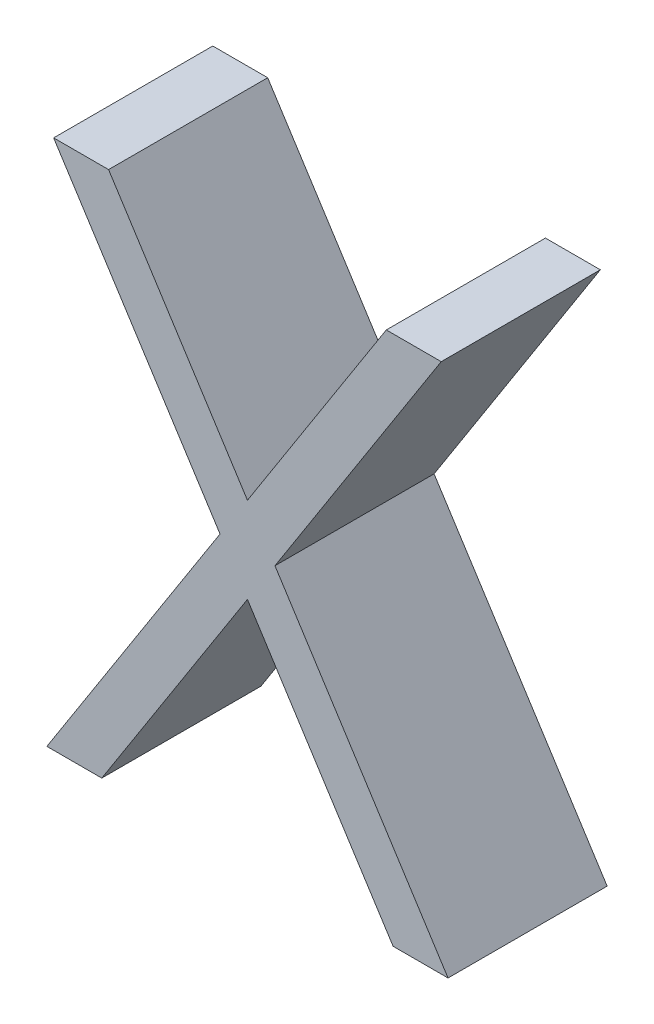
ISO-10303-21;
HEADER;
FILE_DESCRIPTION(('STEP AP214'),'2;1');
FILE_NAME('part.step','',(''),(''),'','','');
FILE_SCHEMA(('AUTOMOTIVE_DESIGN { 1 0 10303 214 1 1 1 1 }'));
ENDSEC;
DATA;
#1=APPLICATION_CONTEXT('core data for automotive mechanical design processes');
#2=APPLICATION_PROTOCOL_DEFINITION('international standard','automotive_design',2000,#1);
#3=PRODUCT_CONTEXT('',#1,'mechanical');
#4=PRODUCT('Part','Part','',(#3));
#5=PRODUCT_RELATED_PRODUCT_CATEGORY('part','',(#4));
#6=PRODUCT_DEFINITION_FORMATION('','',#4);
#7=PRODUCT_DEFINITION_CONTEXT('part definition',#1,'design');
#8=PRODUCT_DEFINITION('design','',#6,#7);
#9=PRODUCT_DEFINITION_SHAPE('','',#8);
#10=(LENGTH_UNIT() NAMED_UNIT(*) SI_UNIT(.MILLI.,.METRE.));
#11=(NAMED_UNIT(*) PLANE_ANGLE_UNIT() SI_UNIT($,.RADIAN.));
#12=(NAMED_UNIT(*) SI_UNIT($,.STERADIAN.) SOLID_ANGLE_UNIT());
#13=UNCERTAINTY_MEASURE_WITH_UNIT(LENGTH_MEASURE(1.E-05),#10,'distance_accuracy_value','');
#14=(GEOMETRIC_REPRESENTATION_CONTEXT(3) GLOBAL_UNCERTAINTY_ASSIGNED_CONTEXT((#13)) GLOBAL_UNIT_ASSIGNED_CONTEXT((#10,
#11,#12)) REPRESENTATION_CONTEXT('',''));
#15=CARTESIAN_POINT('',(0.,0.,0.));
#16=DIRECTION('',(0.,0.,1.));
#17=DIRECTION('',(1.,0.,0.));
#18=AXIS2_PLACEMENT_3D('',#15,#16,#17);
#19=CARTESIAN_POINT('',(-54.216519813049,-20.3200389480257,1.5));
#20=DIRECTION('',(-0.842183846324754,-0.539190475611025,0.));
#21=DIRECTION('',(0.539190475611025,-0.842183846324754,0.));
#22=AXIS2_PLACEMENT_3D('',#19,#20,#21);
#23=PLANE('',#22);
#24=DIRECTION('',(-0.539190475611025,0.842183846324754,0.));
#25=VECTOR('',#24,1.);
#26=CARTESIAN_POINT('',(-54.216519813049,-20.3200389480257,0.));
#27=LINE('',#26,#25);
#28=CARTESIAN_POINT('',(-54.216519813049,-20.3200389480257,0.));
#29=VERTEX_POINT('',#28);
#30=CARTESIAN_POINT('',(-55.7850294284336,-17.8701190762308,0.));
#31=VERTEX_POINT('',#30);
#32=EDGE_CURVE('E154',#29,#31,#27,.T.);
#33=ORIENTED_EDGE('',*,*,#32,.F.);
#34=DIRECTION('',(0.,0.,-1.));
#35=VECTOR('',#34,1.);
#36=CARTESIAN_POINT('',(-54.216519813049,-20.3200389480257,1.5));
#37=LINE('',#36,#35);
#38=CARTESIAN_POINT('',(-54.216519813049,-20.3200389480257,1.5));
#39=VERTEX_POINT('',#38);
#40=EDGE_CURVE('E11',#39,#29,#37,.T.);
#41=ORIENTED_EDGE('',*,*,#40,.F.);
#42=DIRECTION('',(-0.539190475611025,0.842183846324754,0.));
#43=VECTOR('',#42,1.);
#44=CARTESIAN_POINT('',(-54.216519813049,-20.3200389480257,1.5));
#45=LINE('',#44,#43);
#46=CARTESIAN_POINT('',(-55.7850294284336,-17.8701190762308,1.5));
#47=VERTEX_POINT('',#46);
#48=EDGE_CURVE('E186',#39,#47,#45,.T.);
#49=ORIENTED_EDGE('',*,*,#48,.T.);
#50=DIRECTION('',(0.,0.,-1.));
#51=VECTOR('',#50,1.);
#52=CARTESIAN_POINT('',(-55.7850294284336,-17.8701190762308,1.5));
#53=LINE('',#52,#51);
#54=EDGE_CURVE('E36',#47,#31,#53,.T.);
#55=ORIENTED_EDGE('',*,*,#54,.T.);
#56=EDGE_LOOP('',(#33,#41,#49,#55));
#57=FACE_BOUND('',#56,.T.);
#58=ADVANCED_FACE('F33',(#57),#23,.T.);
#59=CARTESIAN_POINT('',(-55.8491319925362,-22.8701190762308,1.5));
#60=DIRECTION('',(-0.842187285298113,0.539185104098949,0.));
#61=DIRECTION('',(-0.53918510409895,-0.842187285298113,0.));
#62=AXIS2_PLACEMENT_3D('',#59,#60,#61);
#63=PLANE('',#62);
#64=DIRECTION('',(0.53918510409895,0.842187285298113,0.));
#65=VECTOR('',#64,1.);
#66=CARTESIAN_POINT('',(-55.8491319925362,-22.8701190762308,0.));
#67=LINE('',#66,#65);
#68=CARTESIAN_POINT('',(-55.8491319925362,-22.8701190762308,0.));
#69=VERTEX_POINT('',#68);
#70=EDGE_CURVE('E184',#69,#29,#67,.T.);
#71=ORIENTED_EDGE('',*,*,#70,.F.);
#72=DIRECTION('',(0.,0.,-1.));
#73=VECTOR('',#72,1.);
#74=CARTESIAN_POINT('',(-55.8491319925362,-22.8701190762308,1.5));
#75=LINE('',#74,#73);
#76=CARTESIAN_POINT('',(-55.8491319925362,-22.8701190762308,1.5));
#77=VERTEX_POINT('',#76);
#78=EDGE_CURVE('E42',#77,#69,#75,.T.);
#79=ORIENTED_EDGE('',*,*,#78,.F.);
#80=DIRECTION('',(0.53918510409895,0.842187285298113,0.));
#81=VECTOR('',#80,1.);
#82=CARTESIAN_POINT('',(-55.8491319925362,-22.8701190762308,1.5));
#83=LINE('',#82,#81);
#84=EDGE_CURVE('E144',#77,#39,#83,.T.);
#85=ORIENTED_EDGE('',*,*,#84,.T.);
#86=ORIENTED_EDGE('',*,*,#40,.T.);
#87=EDGE_LOOP('',(#71,#79,#85,#86));
#88=FACE_BOUND('',#87,.T.);
#89=ADVANCED_FACE('F206',(#88),#63,.T.);
#90=CARTESIAN_POINT('',(-55.3313034668952,-22.8701190762308,1.5));
#91=DIRECTION('',(0.,-1.,0.));
#92=DIRECTION('',(0.,0.,-1.));
#93=AXIS2_PLACEMENT_3D('',#90,#91,#92);
#94=PLANE('',#93);
#95=DIRECTION('',(-1.,0.,0.));
#96=VECTOR('',#95,1.);
#97=CARTESIAN_POINT('',(-55.3313034668952,-22.8701190762308,0.));
#98=LINE('',#97,#96);
#99=CARTESIAN_POINT('',(-55.3313034668952,-22.8701190762308,0.));
#100=VERTEX_POINT('',#99);
#101=EDGE_CURVE('E131',#100,#69,#98,.T.);
#102=ORIENTED_EDGE('',*,*,#101,.F.);
#103=DIRECTION('',(0.,0.,-1.));
#104=VECTOR('',#103,1.);
#105=CARTESIAN_POINT('',(-55.3313034668952,-22.8701190762308,1.5));
#106=LINE('',#105,#104);
#107=CARTESIAN_POINT('',(-55.3313034668952,-22.8701190762308,1.5));
#108=VERTEX_POINT('',#107);
#109=EDGE_CURVE('E126',#108,#100,#106,.T.);
#110=ORIENTED_EDGE('',*,*,#109,.F.);
#111=DIRECTION('',(-1.,0.,0.));
#112=VECTOR('',#111,1.);
#113=CARTESIAN_POINT('',(-55.3313034668952,-22.8701190762308,1.5));
#114=LINE('',#113,#112);
#115=EDGE_CURVE('E129',#108,#77,#114,.T.);
#116=ORIENTED_EDGE('',*,*,#115,.T.);
#117=ORIENTED_EDGE('',*,*,#78,.T.);
#118=EDGE_LOOP('',(#102,#110,#116,#117));
#119=FACE_BOUND('',#118,.T.);
#120=ADVANCED_FACE('F128',(#119),#94,.T.);
#121=CARTESIAN_POINT('',(-53.9581063515106,-20.7246863839231,1.5));
#122=DIRECTION('',(0.842249976671646,-0.539087169942497,0.));
#123=DIRECTION('',(0.539087169942497,0.842249976671647,0.));
#124=AXIS2_PLACEMENT_3D('',#121,#122,#123);
#125=PLANE('',#124);
#126=DIRECTION('',(-0.539087169942497,-0.842249976671646,0.));
#127=VECTOR('',#126,1.);
#128=CARTESIAN_POINT('',(-53.9581063515106,-20.7246863839231,0.));
#129=LINE('',#128,#127);
#130=CARTESIAN_POINT('',(-53.9581063515106,-20.7246863839231,0.));
#131=VERTEX_POINT('',#130);
#132=EDGE_CURVE('E181',#131,#100,#129,.T.);
#133=ORIENTED_EDGE('',*,*,#132,.F.);
#134=DIRECTION('',(0.,0.,-1.));
#135=VECTOR('',#134,1.);
#136=CARTESIAN_POINT('',(-53.9581063515106,-20.7246863839231,1.5));
#137=LINE('',#136,#135);
#138=CARTESIAN_POINT('',(-53.9581063515106,-20.7246863839231,1.5));
#139=VERTEX_POINT('',#138);
#140=EDGE_CURVE('E136',#139,#131,#137,.T.);
#141=ORIENTED_EDGE('',*,*,#140,.F.);
#142=DIRECTION('',(-0.539087169942497,-0.842249976671646,0.));
#143=VECTOR('',#142,1.);
#144=CARTESIAN_POINT('',(-53.9581063515106,-20.7246863839231,1.5));
#145=LINE('',#144,#143);
#146=EDGE_CURVE('E142',#139,#108,#145,.T.);
#147=ORIENTED_EDGE('',*,*,#146,.T.);
#148=ORIENTED_EDGE('',*,*,#109,.T.);
#149=EDGE_LOOP('',(#133,#141,#147,#148));
#150=FACE_BOUND('',#149,.T.);
#151=ADVANCED_FACE('F146',(#150),#125,.T.);
#152=CARTESIAN_POINT('',(-52.584909236126,-22.8701190762308,1.5));
#153=DIRECTION('',(-0.842249976671648,-0.539087169942495,0.));
#154=DIRECTION('',(0.539087169942495,-0.842249976671648,0.));
#155=AXIS2_PLACEMENT_3D('',#152,#153,#154);
#156=PLANE('',#155);
#157=DIRECTION('',(-0.539087169942496,0.842249976671648,0.));
#158=VECTOR('',#157,1.);
#159=CARTESIAN_POINT('',(-52.584909236126,-22.8701190762308,0.));
#160=LINE('',#159,#158);
#161=CARTESIAN_POINT('',(-52.584909236126,-22.8701190762308,0.));
#162=VERTEX_POINT('',#161);
#163=EDGE_CURVE('E178',#162,#131,#160,.T.);
#164=ORIENTED_EDGE('',*,*,#163,.F.);
#165=DIRECTION('',(0.,0.,-1.));
#166=VECTOR('',#165,1.);
#167=CARTESIAN_POINT('',(-52.584909236126,-22.8701190762308,1.5));
#168=LINE('',#167,#166);
#169=CARTESIAN_POINT('',(-52.584909236126,-22.8701190762308,1.5));
#170=VERTEX_POINT('',#169);
#171=EDGE_CURVE('E190',#170,#162,#168,.T.);
#172=ORIENTED_EDGE('',*,*,#171,.F.);
#173=DIRECTION('',(-0.539087169942496,0.842249976671648,0.));
#174=VECTOR('',#173,1.);
#175=CARTESIAN_POINT('',(-52.584909236126,-22.8701190762308,1.5));
#176=LINE('',#175,#174);
#177=EDGE_CURVE('E147',#170,#139,#176,.T.);
#178=ORIENTED_EDGE('',*,*,#177,.T.);
#179=ORIENTED_EDGE('',*,*,#140,.T.);
#180=EDGE_LOOP('',(#164,#172,#178,#179));
#181=FACE_BOUND('',#180,.T.);
#182=ADVANCED_FACE('F219',(#181),#156,.T.);
#183=CARTESIAN_POINT('',(-52.0670807104849,-22.8701190762308,1.5));
#184=DIRECTION('',(0.,-1.,0.));
#185=DIRECTION('',(0.,0.,-1.));
#186=AXIS2_PLACEMENT_3D('',#183,#184,#185);
#187=PLANE('',#186);
#188=DIRECTION('',(-1.,0.,0.));
#189=VECTOR('',#188,1.);
#190=CARTESIAN_POINT('',(-52.0670807104849,-22.8701190762308,0.));
#191=LINE('',#190,#189);
#192=CARTESIAN_POINT('',(-52.0670807104849,-22.8701190762308,0.));
#193=VERTEX_POINT('',#192);
#194=EDGE_CURVE('E175',#193,#162,#191,.T.);
#195=ORIENTED_EDGE('',*,*,#194,.F.);
#196=DIRECTION('',(0.,0.,-1.));
#197=VECTOR('',#196,1.);
#198=CARTESIAN_POINT('',(-52.0670807104849,-22.8701190762308,1.5));
#199=LINE('',#198,#197);
#200=CARTESIAN_POINT('',(-52.0670807104849,-22.8701190762308,1.5));
#201=VERTEX_POINT('',#200);
#202=EDGE_CURVE('E192',#201,#193,#199,.T.);
#203=ORIENTED_EDGE('',*,*,#202,.F.);
#204=DIRECTION('',(-1.,0.,0.));
#205=VECTOR('',#204,1.);
#206=CARTESIAN_POINT('',(-52.0670807104849,-22.8701190762308,1.5));
#207=LINE('',#206,#205);
#208=EDGE_CURVE('E149',#201,#170,#207,.T.);
#209=ORIENTED_EDGE('',*,*,#208,.T.);
#210=ORIENTED_EDGE('',*,*,#171,.T.);
#211=EDGE_LOOP('',(#195,#203,#209,#210));
#212=FACE_BOUND('',#211,.T.);
#213=ADVANCED_FACE('F222',(#212),#187,.T.);
#214=CARTESIAN_POINT('',(-53.698691287408,-20.3200389480257,1.5));
#215=DIRECTION('',(0.842337488703707,0.538950419912938,0.));
#216=DIRECTION('',(-0.538950419912938,0.842337488703707,0.));
#217=AXIS2_PLACEMENT_3D('',#214,#215,#216);
#218=PLANE('',#217);
#219=DIRECTION('',(0.538950419912938,-0.842337488703707,0.));
#220=VECTOR('',#219,1.);
#221=CARTESIAN_POINT('',(-53.698691287408,-20.3200389480257,0.));
#222=LINE('',#221,#220);
#223=CARTESIAN_POINT('',(-53.698691287408,-20.3200389480257,0.));
#224=VERTEX_POINT('',#223);
#225=EDGE_CURVE('E172',#224,#193,#222,.T.);
#226=ORIENTED_EDGE('',*,*,#225,.F.);
#227=DIRECTION('',(0.,0.,-1.));
#228=VECTOR('',#227,1.);
#229=CARTESIAN_POINT('',(-53.698691287408,-20.3200389480257,1.5));
#230=LINE('',#229,#228);
#231=CARTESIAN_POINT('',(-53.698691287408,-20.3200389480257,1.5));
#232=VERTEX_POINT('',#231);
#233=EDGE_CURVE('E194',#232,#224,#230,.T.);
#234=ORIENTED_EDGE('',*,*,#233,.F.);
#235=DIRECTION('',(0.538950419912938,-0.842337488703707,0.));
#236=VECTOR('',#235,1.);
#237=CARTESIAN_POINT('',(-53.698691287408,-20.3200389480257,1.5));
#238=LINE('',#237,#236);
#239=EDGE_CURVE('E384',#232,#201,#238,.T.);
#240=ORIENTED_EDGE('',*,*,#239,.T.);
#241=ORIENTED_EDGE('',*,*,#202,.T.);
#242=EDGE_LOOP('',(#226,#234,#240,#241));
#243=FACE_BOUND('',#242,.T.);
#244=ADVANCED_FACE('F226',(#243),#218,.T.);
#245=CARTESIAN_POINT('',(-52.1311832745875,-17.8701190762308,1.5));
#246=DIRECTION('',(0.842340190537256,-0.538946197134425,0.));
#247=DIRECTION('',(0.538946197134425,0.842340190537257,0.));
#248=AXIS2_PLACEMENT_3D('',#245,#246,#247);
#249=PLANE('',#248);
#250=DIRECTION('',(-0.538946197134425,-0.842340190537257,0.));
#251=VECTOR('',#250,1.);
#252=CARTESIAN_POINT('',(-52.1311832745875,-17.8701190762308,0.));
#253=LINE('',#252,#251);
#254=CARTESIAN_POINT('',(-52.1311832745875,-17.8701190762308,0.));
#255=VERTEX_POINT('',#254);
#256=EDGE_CURVE('E169',#255,#224,#253,.T.);
#257=ORIENTED_EDGE('',*,*,#256,.F.);
#258=DIRECTION('',(0.,0.,-1.));
#259=VECTOR('',#258,1.);
#260=CARTESIAN_POINT('',(-52.1311832745875,-17.8701190762308,1.5));
#261=LINE('',#260,#259);
#262=CARTESIAN_POINT('',(-52.1311832745875,-17.8701190762308,1.5));
#263=VERTEX_POINT('',#262);
#264=EDGE_CURVE('E196',#263,#255,#261,.T.);
#265=ORIENTED_EDGE('',*,*,#264,.F.);
#266=DIRECTION('',(-0.538946197134425,-0.842340190537257,0.));
#267=VECTOR('',#266,1.);
#268=CARTESIAN_POINT('',(-52.1311832745875,-17.8701190762308,1.5));
#269=LINE('',#268,#267);
#270=EDGE_CURVE('E388',#263,#232,#269,.T.);
#271=ORIENTED_EDGE('',*,*,#270,.T.);
#272=ORIENTED_EDGE('',*,*,#233,.T.);
#273=EDGE_LOOP('',(#257,#265,#271,#272));
#274=FACE_BOUND('',#273,.T.);
#275=ADVANCED_FACE('F230',(#274),#249,.T.);
#276=CARTESIAN_POINT('',(-52.6490118002285,-17.8701190762308,1.5));
#277=DIRECTION('',(0.,1.,0.));
#278=DIRECTION('',(0.,0.,1.));
#279=AXIS2_PLACEMENT_3D('',#276,#277,#278);
#280=PLANE('',#279);
#281=DIRECTION('',(1.,0.,0.));
#282=VECTOR('',#281,1.);
#283=CARTESIAN_POINT('',(-52.6490118002285,-17.8701190762308,0.));
#284=LINE('',#283,#282);
#285=CARTESIAN_POINT('',(-52.6490118002285,-17.8701190762308,0.));
#286=VERTEX_POINT('',#285);
#287=EDGE_CURVE('E166',#286,#255,#284,.T.);
#288=ORIENTED_EDGE('',*,*,#287,.F.);
#289=DIRECTION('',(0.,0.,-1.));
#290=VECTOR('',#289,1.);
#291=CARTESIAN_POINT('',(-52.6490118002285,-17.8701190762308,1.5));
#292=LINE('',#291,#290);
#293=CARTESIAN_POINT('',(-52.6490118002285,-17.8701190762308,1.5));
#294=VERTEX_POINT('',#293);
#295=EDGE_CURVE('E198',#294,#286,#292,.T.);
#296=ORIENTED_EDGE('',*,*,#295,.F.);
#297=DIRECTION('',(1.,0.,0.));
#298=VECTOR('',#297,1.);
#299=CARTESIAN_POINT('',(-52.6490118002285,-17.8701190762308,1.5));
#300=LINE('',#299,#298);
#301=EDGE_CURVE('E377',#294,#263,#300,.T.);
#302=ORIENTED_EDGE('',*,*,#301,.T.);
#303=ORIENTED_EDGE('',*,*,#264,.T.);
#304=EDGE_LOOP('',(#288,#296,#302,#303));
#305=FACE_BOUND('',#304,.T.);
#306=ADVANCED_FACE('F234',(#305),#280,.T.);
#307=CARTESIAN_POINT('',(-53.9581063515106,-19.9153915121283,1.5));
#308=DIRECTION('',(-0.842248927498486,0.539088809128561,0.));
#309=DIRECTION('',(-0.539088809128561,-0.842248927498486,0.));
#310=AXIS2_PLACEMENT_3D('',#307,#308,#309);
#311=PLANE('',#310);
#312=DIRECTION('',(0.539088809128561,0.842248927498486,0.));
#313=VECTOR('',#312,1.);
#314=CARTESIAN_POINT('',(-53.9581063515106,-19.9153915121283,0.));
#315=LINE('',#314,#313);
#316=CARTESIAN_POINT('',(-53.9581063515106,-19.9153915121283,0.));
#317=VERTEX_POINT('',#316);
#318=EDGE_CURVE('E163',#317,#286,#315,.T.);
#319=ORIENTED_EDGE('',*,*,#318,.F.);
#320=DIRECTION('',(0.,0.,-1.));
#321=VECTOR('',#320,1.);
#322=CARTESIAN_POINT('',(-53.9581063515106,-19.9153915121283,1.5));
#323=LINE('',#322,#321);
#324=CARTESIAN_POINT('',(-53.9581063515106,-19.9153915121283,1.5));
#325=VERTEX_POINT('',#324);
#326=EDGE_CURVE('E200',#325,#317,#323,.T.);
#327=ORIENTED_EDGE('',*,*,#326,.F.);
#328=DIRECTION('',(0.539088809128561,0.842248927498486,0.));
#329=VECTOR('',#328,1.);
#330=CARTESIAN_POINT('',(-53.9581063515106,-19.9153915121283,1.5));
#331=LINE('',#330,#329);
#332=EDGE_CURVE('E373',#325,#294,#331,.T.);
#333=ORIENTED_EDGE('',*,*,#332,.T.);
#334=ORIENTED_EDGE('',*,*,#295,.T.);
#335=EDGE_LOOP('',(#319,#327,#333,#334));
#336=FACE_BOUND('',#335,.T.);
#337=ADVANCED_FACE('F238',(#336),#311,.T.);
#338=CARTESIAN_POINT('',(-55.2672009027926,-17.8701190762308,1.5));
#339=DIRECTION('',(0.842248927498486,0.539088809128561,0.));
#340=DIRECTION('',(-0.539088809128561,0.842248927498486,0.));
#341=AXIS2_PLACEMENT_3D('',#338,#339,#340);
#342=PLANE('',#341);
#343=DIRECTION('',(0.539088809128561,-0.842248927498486,0.));
#344=VECTOR('',#343,1.);
#345=CARTESIAN_POINT('',(-55.2672009027926,-17.8701190762308,0.));
#346=LINE('',#345,#344);
#347=CARTESIAN_POINT('',(-55.2672009027926,-17.8701190762308,0.));
#348=VERTEX_POINT('',#347);
#349=EDGE_CURVE('E160',#348,#317,#346,.T.);
#350=ORIENTED_EDGE('',*,*,#349,.F.);
#351=DIRECTION('',(0.,0.,-1.));
#352=VECTOR('',#351,1.);
#353=CARTESIAN_POINT('',(-55.2672009027926,-17.8701190762308,1.5));
#354=LINE('',#353,#352);
#355=CARTESIAN_POINT('',(-55.2672009027926,-17.8701190762308,1.5));
#356=VERTEX_POINT('',#355);
#357=EDGE_CURVE('E201',#356,#348,#354,.T.);
#358=ORIENTED_EDGE('',*,*,#357,.F.);
#359=DIRECTION('',(0.539088809128561,-0.842248927498486,0.));
#360=VECTOR('',#359,1.);
#361=CARTESIAN_POINT('',(-55.2672009027926,-17.8701190762308,1.5));
#362=LINE('',#361,#360);
#363=EDGE_CURVE('E394',#356,#325,#362,.T.);
#364=ORIENTED_EDGE('',*,*,#363,.T.);
#365=ORIENTED_EDGE('',*,*,#326,.T.);
#366=EDGE_LOOP('',(#350,#358,#364,#365));
#367=FACE_BOUND('',#366,.T.);
#368=ADVANCED_FACE('F242',(#367),#342,.T.);
#369=CARTESIAN_POINT('',(-55.7850294284336,-17.8701190762308,1.5));
#370=DIRECTION('',(0.,1.,0.));
#371=DIRECTION('',(0.,0.,1.));
#372=AXIS2_PLACEMENT_3D('',#369,#370,#371);
#373=PLANE('',#372);
#374=DIRECTION('',(1.,0.,0.));
#375=VECTOR('',#374,1.);
#376=CARTESIAN_POINT('',(-55.7850294284336,-17.8701190762308,0.));
#377=LINE('',#376,#375);
#378=EDGE_CURVE('E157',#31,#348,#377,.T.);
#379=ORIENTED_EDGE('',*,*,#378,.F.);
#380=ORIENTED_EDGE('',*,*,#54,.F.);
#381=DIRECTION('',(1.,0.,0.));
#382=VECTOR('',#381,1.);
#383=CARTESIAN_POINT('',(-55.7850294284336,-17.8701190762308,1.5));
#384=LINE('',#383,#382);
#385=EDGE_CURVE('E396',#47,#356,#384,.T.);
#386=ORIENTED_EDGE('',*,*,#385,.T.);
#387=ORIENTED_EDGE('',*,*,#357,.T.);
#388=EDGE_LOOP('',(#379,#380,#386,#387));
#389=FACE_BOUND('',#388,.T.);
#390=ADVANCED_FACE('F203',(#389),#373,.T.);
#391=CARTESIAN_POINT('',(0.,0.,1.5));
#392=DIRECTION('',(0.,0.,-1.));
#393=DIRECTION('',(-1.,0.,0.));
#394=AXIS2_PLACEMENT_3D('',#391,#392,#393);
#395=PLANE('',#394);
#396=ORIENTED_EDGE('',*,*,#48,.F.);
#397=ORIENTED_EDGE('',*,*,#84,.F.);
#398=ORIENTED_EDGE('',*,*,#115,.F.);
#399=ORIENTED_EDGE('',*,*,#146,.F.);
#400=ORIENTED_EDGE('',*,*,#177,.F.);
#401=ORIENTED_EDGE('',*,*,#208,.F.);
#402=ORIENTED_EDGE('',*,*,#239,.F.);
#403=ORIENTED_EDGE('',*,*,#270,.F.);
#404=ORIENTED_EDGE('',*,*,#301,.F.);
#405=ORIENTED_EDGE('',*,*,#332,.F.);
#406=ORIENTED_EDGE('',*,*,#363,.F.);
#407=ORIENTED_EDGE('',*,*,#385,.F.);
#408=EDGE_LOOP('',(#396,#397,#398,#399,#400,#401,#402,#403,#404,#405,#406,#407));
#409=FACE_BOUND('',#408,.T.);
#410=ADVANCED_FACE('F140',(#409),#395,.F.);
#411=CARTESIAN_POINT('',(0.,0.,0.));
#412=DIRECTION('',(0.,0.,-1.));
#413=DIRECTION('',(-1.,0.,0.));
#414=AXIS2_PLACEMENT_3D('',#411,#412,#413);
#415=PLANE('',#414);
#416=ORIENTED_EDGE('',*,*,#32,.T.);
#417=ORIENTED_EDGE('',*,*,#378,.T.);
#418=ORIENTED_EDGE('',*,*,#349,.T.);
#419=ORIENTED_EDGE('',*,*,#318,.T.);
#420=ORIENTED_EDGE('',*,*,#287,.T.);
#421=ORIENTED_EDGE('',*,*,#256,.T.);
#422=ORIENTED_EDGE('',*,*,#225,.T.);
#423=ORIENTED_EDGE('',*,*,#194,.T.);
#424=ORIENTED_EDGE('',*,*,#163,.T.);
#425=ORIENTED_EDGE('',*,*,#132,.T.);
#426=ORIENTED_EDGE('',*,*,#101,.T.);
#427=ORIENTED_EDGE('',*,*,#70,.T.);
#428=EDGE_LOOP('',(#416,#417,#418,#419,#420,#421,#422,#423,#424,#425,#426,#427));
#429=FACE_BOUND('',#428,.T.);
#430=ADVANCED_FACE('F205',(#429),#415,.T.);
#431=CLOSED_SHELL('',(#58,#89,#120,#151,#182,#213,#244,#275,#306,#337,#368,#390,#410,#430));
#432=MANIFOLD_SOLID_BREP('B2',#431);
#433=ADVANCED_BREP_SHAPE_REPRESENTATION('',(#18,#432),#14);
#434=SHAPE_DEFINITION_REPRESENTATION(#9,#433);
ENDSEC;
END-ISO-10303-21;
